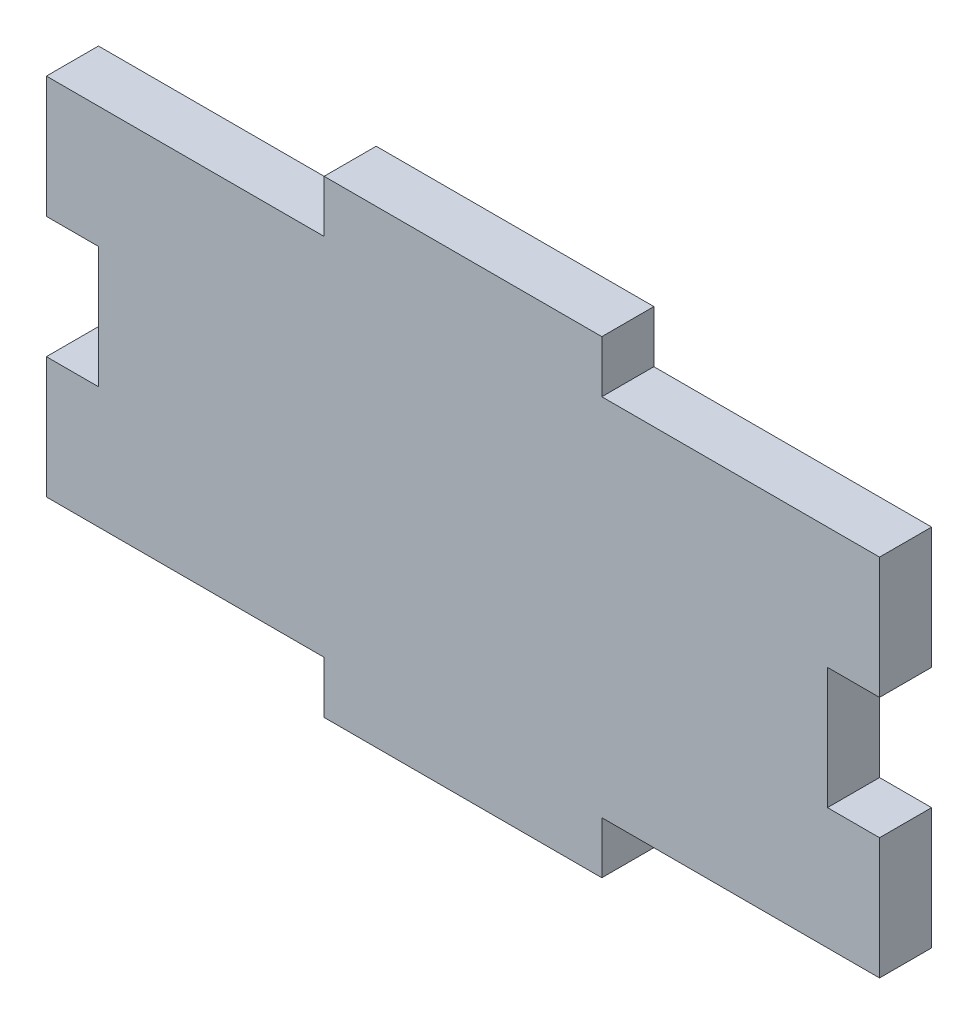
ISO-10303-21;
HEADER;
FILE_DESCRIPTION(('STEP AP214'),'2;1');
FILE_NAME('part.step','',(''),(''),'','','');
FILE_SCHEMA(('AUTOMOTIVE_DESIGN { 1 0 10303 214 1 1 1 1 }'));
ENDSEC;
DATA;
#1=APPLICATION_CONTEXT('core data for automotive mechanical design processes');
#2=APPLICATION_PROTOCOL_DEFINITION('international standard','automotive_design',2000,#1);
#3=PRODUCT_CONTEXT('',#1,'mechanical');
#4=PRODUCT('Part','Part','',(#3));
#5=PRODUCT_RELATED_PRODUCT_CATEGORY('part','',(#4));
#6=PRODUCT_DEFINITION_FORMATION('','',#4);
#7=PRODUCT_DEFINITION_CONTEXT('part definition',#1,'design');
#8=PRODUCT_DEFINITION('design','',#6,#7);
#9=PRODUCT_DEFINITION_SHAPE('','',#8);
#10=(LENGTH_UNIT() NAMED_UNIT(*) SI_UNIT(.MILLI.,.METRE.));
#11=(NAMED_UNIT(*) PLANE_ANGLE_UNIT() SI_UNIT($,.RADIAN.));
#12=(NAMED_UNIT(*) SI_UNIT($,.STERADIAN.) SOLID_ANGLE_UNIT());
#13=UNCERTAINTY_MEASURE_WITH_UNIT(LENGTH_MEASURE(1.E-05),#10,'distance_accuracy_value','');
#14=(GEOMETRIC_REPRESENTATION_CONTEXT(3) GLOBAL_UNCERTAINTY_ASSIGNED_CONTEXT((#13)) GLOBAL_UNIT_ASSIGNED_CONTEXT((#10,
#11,#12)) REPRESENTATION_CONTEXT('',''));
#15=CARTESIAN_POINT('',(0.,0.,0.));
#16=DIRECTION('',(0.,0.,1.));
#17=DIRECTION('',(1.,0.,0.));
#18=AXIS2_PLACEMENT_3D('',#15,#16,#17);
#19=CARTESIAN_POINT('',(-24.,10.5,3.));
#20=DIRECTION('',(1.,0.,0.));
#21=DIRECTION('',(0.,0.,-1.));
#22=AXIS2_PLACEMENT_3D('',#19,#20,#21);
#23=PLANE('',#22);
#24=DIRECTION('',(0.,-1.,0.));
#25=VECTOR('',#24,1.);
#26=CARTESIAN_POINT('',(-24.,10.5,0.));
#27=LINE('',#26,#25);
#28=CARTESIAN_POINT('',(-24.,10.5,0.));
#29=VERTEX_POINT('',#28);
#30=CARTESIAN_POINT('',(-24.,3.5,0.));
#31=VERTEX_POINT('',#30);
#32=EDGE_CURVE('E201',#29,#31,#27,.T.);
#33=ORIENTED_EDGE('',*,*,#32,.T.);
#34=DIRECTION('',(0.,0.,-1.));
#35=VECTOR('',#34,1.);
#36=CARTESIAN_POINT('',(-24.,3.5,3.));
#37=LINE('',#36,#35);
#38=CARTESIAN_POINT('',(-24.,3.5,3.));
#39=VERTEX_POINT('',#38);
#40=EDGE_CURVE('E11',#39,#31,#37,.T.);
#41=ORIENTED_EDGE('',*,*,#40,.F.);
#42=DIRECTION('',(0.,-1.,0.));
#43=VECTOR('',#42,1.);
#44=CARTESIAN_POINT('',(-24.,10.5,3.));
#45=LINE('',#44,#43);
#46=CARTESIAN_POINT('',(-24.,10.5,3.));
#47=VERTEX_POINT('',#46);
#48=EDGE_CURVE('E249',#47,#39,#45,.T.);
#49=ORIENTED_EDGE('',*,*,#48,.F.);
#50=DIRECTION('',(0.,0.,-1.));
#51=VECTOR('',#50,1.);
#52=CARTESIAN_POINT('',(-24.,10.5,3.));
#53=LINE('',#52,#51);
#54=EDGE_CURVE('E48',#47,#29,#53,.T.);
#55=ORIENTED_EDGE('',*,*,#54,.T.);
#56=EDGE_LOOP('',(#33,#41,#49,#55));
#57=FACE_BOUND('',#56,.T.);
#58=ADVANCED_FACE('F32',(#57),#23,.F.);
#59=CARTESIAN_POINT('',(-24.,3.5,3.));
#60=DIRECTION('',(0.,1.,0.));
#61=DIRECTION('',(-1.,0.,0.));
#62=AXIS2_PLACEMENT_3D('',#59,#60,#61);
#63=PLANE('',#62);
#64=DIRECTION('',(1.,0.,0.));
#65=VECTOR('',#64,1.);
#66=CARTESIAN_POINT('',(-24.,3.5,0.));
#67=LINE('',#66,#65);
#68=CARTESIAN_POINT('',(-21.,3.5,0.));
#69=VERTEX_POINT('',#68);
#70=EDGE_CURVE('E203',#31,#69,#67,.T.);
#71=ORIENTED_EDGE('',*,*,#70,.T.);
#72=DIRECTION('',(0.,0.,-1.));
#73=VECTOR('',#72,1.);
#74=CARTESIAN_POINT('',(-21.,3.5,3.));
#75=LINE('',#74,#73);
#76=CARTESIAN_POINT('',(-21.,3.5,3.));
#77=VERTEX_POINT('',#76);
#78=EDGE_CURVE('E40',#77,#69,#75,.T.);
#79=ORIENTED_EDGE('',*,*,#78,.F.);
#80=DIRECTION('',(1.,0.,0.));
#81=VECTOR('',#80,1.);
#82=CARTESIAN_POINT('',(-24.,3.5,3.));
#83=LINE('',#82,#81);
#84=EDGE_CURVE('E122',#39,#77,#83,.T.);
#85=ORIENTED_EDGE('',*,*,#84,.F.);
#86=ORIENTED_EDGE('',*,*,#40,.T.);
#87=EDGE_LOOP('',(#71,#79,#85,#86));
#88=FACE_BOUND('',#87,.T.);
#89=ADVANCED_FACE('F356',(#88),#63,.F.);
#90=CARTESIAN_POINT('',(-21.,3.5,3.));
#91=DIRECTION('',(1.,0.,0.));
#92=DIRECTION('',(0.,0.,-1.));
#93=AXIS2_PLACEMENT_3D('',#90,#91,#92);
#94=PLANE('',#93);
#95=DIRECTION('',(0.,-1.,0.));
#96=VECTOR('',#95,1.);
#97=CARTESIAN_POINT('',(-21.,3.5,0.));
#98=LINE('',#97,#96);
#99=CARTESIAN_POINT('',(-21.,-3.5,0.));
#100=VERTEX_POINT('',#99);
#101=EDGE_CURVE('E205',#69,#100,#98,.T.);
#102=ORIENTED_EDGE('',*,*,#101,.T.);
#103=DIRECTION('',(0.,0.,-1.));
#104=VECTOR('',#103,1.);
#105=CARTESIAN_POINT('',(-21.,-3.5,3.));
#106=LINE('',#105,#104);
#107=CARTESIAN_POINT('',(-21.,-3.5,3.));
#108=VERTEX_POINT('',#107);
#109=EDGE_CURVE('E285',#108,#100,#106,.T.);
#110=ORIENTED_EDGE('',*,*,#109,.F.);
#111=DIRECTION('',(0.,-1.,0.));
#112=VECTOR('',#111,1.);
#113=CARTESIAN_POINT('',(-21.,3.5,3.));
#114=LINE('',#113,#112);
#115=EDGE_CURVE('E293',#77,#108,#114,.T.);
#116=ORIENTED_EDGE('',*,*,#115,.F.);
#117=ORIENTED_EDGE('',*,*,#78,.T.);
#118=EDGE_LOOP('',(#102,#110,#116,#117));
#119=FACE_BOUND('',#118,.T.);
#120=ADVANCED_FACE('F291',(#119),#94,.F.);
#121=CARTESIAN_POINT('',(-21.,-3.5,3.));
#122=DIRECTION('',(0.,-1.,0.));
#123=DIRECTION('',(1.,0.,0.));
#124=AXIS2_PLACEMENT_3D('',#121,#122,#123);
#125=PLANE('',#124);
#126=DIRECTION('',(-1.,0.,0.));
#127=VECTOR('',#126,1.);
#128=CARTESIAN_POINT('',(-21.,-3.5,0.));
#129=LINE('',#128,#127);
#130=CARTESIAN_POINT('',(-24.,-3.5,0.));
#131=VERTEX_POINT('',#130);
#132=EDGE_CURVE('E207',#100,#131,#129,.T.);
#133=ORIENTED_EDGE('',*,*,#132,.T.);
#134=DIRECTION('',(0.,0.,-1.));
#135=VECTOR('',#134,1.);
#136=CARTESIAN_POINT('',(-24.,-3.5,3.));
#137=LINE('',#136,#135);
#138=CARTESIAN_POINT('',(-24.,-3.5,3.));
#139=VERTEX_POINT('',#138);
#140=EDGE_CURVE('E282',#139,#131,#137,.T.);
#141=ORIENTED_EDGE('',*,*,#140,.F.);
#142=DIRECTION('',(-1.,0.,0.));
#143=VECTOR('',#142,1.);
#144=CARTESIAN_POINT('',(-21.,-3.5,3.));
#145=LINE('',#144,#143);
#146=EDGE_CURVE('E310',#108,#139,#145,.T.);
#147=ORIENTED_EDGE('',*,*,#146,.F.);
#148=ORIENTED_EDGE('',*,*,#109,.T.);
#149=EDGE_LOOP('',(#133,#141,#147,#148));
#150=FACE_BOUND('',#149,.T.);
#151=ADVANCED_FACE('F301',(#150),#125,.F.);
#152=CARTESIAN_POINT('',(-24.,-3.5,3.));
#153=DIRECTION('',(1.,0.,0.));
#154=DIRECTION('',(0.,0.,-1.));
#155=AXIS2_PLACEMENT_3D('',#152,#153,#154);
#156=PLANE('',#155);
#157=DIRECTION('',(0.,-1.,0.));
#158=VECTOR('',#157,1.);
#159=CARTESIAN_POINT('',(-24.,-3.5,0.));
#160=LINE('',#159,#158);
#161=CARTESIAN_POINT('',(-24.,-10.5,0.));
#162=VERTEX_POINT('',#161);
#163=EDGE_CURVE('E209',#131,#162,#160,.T.);
#164=ORIENTED_EDGE('',*,*,#163,.T.);
#165=DIRECTION('',(0.,0.,-1.));
#166=VECTOR('',#165,1.);
#167=CARTESIAN_POINT('',(-24.,-10.5,3.));
#168=LINE('',#167,#166);
#169=CARTESIAN_POINT('',(-24.,-10.5,3.));
#170=VERTEX_POINT('',#169);
#171=EDGE_CURVE('E279',#170,#162,#168,.T.);
#172=ORIENTED_EDGE('',*,*,#171,.F.);
#173=DIRECTION('',(0.,-1.,0.));
#174=VECTOR('',#173,1.);
#175=CARTESIAN_POINT('',(-24.,-3.5,3.));
#176=LINE('',#175,#174);
#177=EDGE_CURVE('E307',#139,#170,#176,.T.);
#178=ORIENTED_EDGE('',*,*,#177,.F.);
#179=ORIENTED_EDGE('',*,*,#140,.T.);
#180=EDGE_LOOP('',(#164,#172,#178,#179));
#181=FACE_BOUND('',#180,.T.);
#182=ADVANCED_FACE('F305',(#181),#156,.F.);
#183=CARTESIAN_POINT('',(-24.,-10.5,3.));
#184=DIRECTION('',(0.,1.,0.));
#185=DIRECTION('',(0.,0.,1.));
#186=AXIS2_PLACEMENT_3D('',#183,#184,#185);
#187=PLANE('',#186);
#188=DIRECTION('',(1.,0.,0.));
#189=VECTOR('',#188,1.);
#190=CARTESIAN_POINT('',(-24.,-10.5,0.));
#191=LINE('',#190,#189);
#192=CARTESIAN_POINT('',(-8.,-10.5,0.));
#193=VERTEX_POINT('',#192);
#194=EDGE_CURVE('E211',#162,#193,#191,.T.);
#195=ORIENTED_EDGE('',*,*,#194,.T.);
#196=DIRECTION('',(0.,0.,-1.));
#197=VECTOR('',#196,1.);
#198=CARTESIAN_POINT('',(-8.,-10.5,3.));
#199=LINE('',#198,#197);
#200=CARTESIAN_POINT('',(-8.,-10.5,3.));
#201=VERTEX_POINT('',#200);
#202=EDGE_CURVE('E276',#201,#193,#199,.T.);
#203=ORIENTED_EDGE('',*,*,#202,.F.);
#204=DIRECTION('',(1.,0.,0.));
#205=VECTOR('',#204,1.);
#206=CARTESIAN_POINT('',(-24.,-10.5,3.));
#207=LINE('',#206,#205);
#208=EDGE_CURVE('E309',#170,#201,#207,.T.);
#209=ORIENTED_EDGE('',*,*,#208,.F.);
#210=ORIENTED_EDGE('',*,*,#171,.T.);
#211=EDGE_LOOP('',(#195,#203,#209,#210));
#212=FACE_BOUND('',#211,.T.);
#213=ADVANCED_FACE('F372',(#212),#187,.F.);
#214=CARTESIAN_POINT('',(-8.,-10.5,3.));
#215=DIRECTION('',(1.,0.,0.));
#216=DIRECTION('',(0.,0.,-1.));
#217=AXIS2_PLACEMENT_3D('',#214,#215,#216);
#218=PLANE('',#217);
#219=DIRECTION('',(0.,-1.,0.));
#220=VECTOR('',#219,1.);
#221=CARTESIAN_POINT('',(-8.,-10.5,0.));
#222=LINE('',#221,#220);
#223=CARTESIAN_POINT('',(-8.,-13.5,0.));
#224=VERTEX_POINT('',#223);
#225=EDGE_CURVE('E213',#193,#224,#222,.T.);
#226=ORIENTED_EDGE('',*,*,#225,.T.);
#227=DIRECTION('',(0.,0.,-1.));
#228=VECTOR('',#227,1.);
#229=CARTESIAN_POINT('',(-8.,-13.5,3.));
#230=LINE('',#229,#228);
#231=CARTESIAN_POINT('',(-8.,-13.5,3.));
#232=VERTEX_POINT('',#231);
#233=EDGE_CURVE('E273',#232,#224,#230,.T.);
#234=ORIENTED_EDGE('',*,*,#233,.F.);
#235=DIRECTION('',(0.,-1.,0.));
#236=VECTOR('',#235,1.);
#237=CARTESIAN_POINT('',(-8.,-10.5,3.));
#238=LINE('',#237,#236);
#239=EDGE_CURVE('E312',#201,#232,#238,.T.);
#240=ORIENTED_EDGE('',*,*,#239,.F.);
#241=ORIENTED_EDGE('',*,*,#202,.T.);
#242=EDGE_LOOP('',(#226,#234,#240,#241));
#243=FACE_BOUND('',#242,.T.);
#244=ADVANCED_FACE('F375',(#243),#218,.F.);
#245=CARTESIAN_POINT('',(-8.,-13.5,3.));
#246=DIRECTION('',(0.,1.,0.));
#247=DIRECTION('',(0.,0.,1.));
#248=AXIS2_PLACEMENT_3D('',#245,#246,#247);
#249=PLANE('',#248);
#250=DIRECTION('',(1.,0.,0.));
#251=VECTOR('',#250,1.);
#252=CARTESIAN_POINT('',(-8.,-13.5,0.));
#253=LINE('',#252,#251);
#254=CARTESIAN_POINT('',(8.,-13.5,0.));
#255=VERTEX_POINT('',#254);
#256=EDGE_CURVE('E215',#224,#255,#253,.T.);
#257=ORIENTED_EDGE('',*,*,#256,.T.);
#258=DIRECTION('',(0.,0.,-1.));
#259=VECTOR('',#258,1.);
#260=CARTESIAN_POINT('',(8.,-13.5,3.));
#261=LINE('',#260,#259);
#262=CARTESIAN_POINT('',(8.,-13.5,3.));
#263=VERTEX_POINT('',#262);
#264=EDGE_CURVE('E270',#263,#255,#261,.T.);
#265=ORIENTED_EDGE('',*,*,#264,.F.);
#266=DIRECTION('',(1.,0.,0.));
#267=VECTOR('',#266,1.);
#268=CARTESIAN_POINT('',(-8.,-13.5,3.));
#269=LINE('',#268,#267);
#270=EDGE_CURVE('E318',#232,#263,#269,.T.);
#271=ORIENTED_EDGE('',*,*,#270,.F.);
#272=ORIENTED_EDGE('',*,*,#233,.T.);
#273=EDGE_LOOP('',(#257,#265,#271,#272));
#274=FACE_BOUND('',#273,.T.);
#275=ADVANCED_FACE('F379',(#274),#249,.F.);
#276=CARTESIAN_POINT('',(8.,-13.5,3.));
#277=DIRECTION('',(-1.,0.,0.));
#278=DIRECTION('',(0.,0.,1.));
#279=AXIS2_PLACEMENT_3D('',#276,#277,#278);
#280=PLANE('',#279);
#281=DIRECTION('',(0.,1.,0.));
#282=VECTOR('',#281,1.);
#283=CARTESIAN_POINT('',(8.,-13.5,0.));
#284=LINE('',#283,#282);
#285=CARTESIAN_POINT('',(8.,-10.5,0.));
#286=VERTEX_POINT('',#285);
#287=EDGE_CURVE('E217',#255,#286,#284,.T.);
#288=ORIENTED_EDGE('',*,*,#287,.T.);
#289=DIRECTION('',(0.,0.,-1.));
#290=VECTOR('',#289,1.);
#291=CARTESIAN_POINT('',(8.,-10.5,3.));
#292=LINE('',#291,#290);
#293=CARTESIAN_POINT('',(8.,-10.5,3.));
#294=VERTEX_POINT('',#293);
#295=EDGE_CURVE('E267',#294,#286,#292,.T.);
#296=ORIENTED_EDGE('',*,*,#295,.F.);
#297=DIRECTION('',(0.,1.,0.));
#298=VECTOR('',#297,1.);
#299=CARTESIAN_POINT('',(8.,-13.5,3.));
#300=LINE('',#299,#298);
#301=EDGE_CURVE('E320',#263,#294,#300,.T.);
#302=ORIENTED_EDGE('',*,*,#301,.F.);
#303=ORIENTED_EDGE('',*,*,#264,.T.);
#304=EDGE_LOOP('',(#288,#296,#302,#303));
#305=FACE_BOUND('',#304,.T.);
#306=ADVANCED_FACE('F383',(#305),#280,.F.);
#307=CARTESIAN_POINT('',(8.,-10.5,3.));
#308=DIRECTION('',(0.,1.,0.));
#309=DIRECTION('',(0.,0.,1.));
#310=AXIS2_PLACEMENT_3D('',#307,#308,#309);
#311=PLANE('',#310);
#312=DIRECTION('',(1.,0.,0.));
#313=VECTOR('',#312,1.);
#314=CARTESIAN_POINT('',(8.,-10.5,0.));
#315=LINE('',#314,#313);
#316=CARTESIAN_POINT('',(24.,-10.5,0.));
#317=VERTEX_POINT('',#316);
#318=EDGE_CURVE('E219',#286,#317,#315,.T.);
#319=ORIENTED_EDGE('',*,*,#318,.T.);
#320=DIRECTION('',(0.,0.,-1.));
#321=VECTOR('',#320,1.);
#322=CARTESIAN_POINT('',(24.,-10.5,3.));
#323=LINE('',#322,#321);
#324=CARTESIAN_POINT('',(24.,-10.5,3.));
#325=VERTEX_POINT('',#324);
#326=EDGE_CURVE('E265',#325,#317,#323,.T.);
#327=ORIENTED_EDGE('',*,*,#326,.F.);
#328=DIRECTION('',(1.,0.,0.));
#329=VECTOR('',#328,1.);
#330=CARTESIAN_POINT('',(8.,-10.5,3.));
#331=LINE('',#330,#329);
#332=EDGE_CURVE('E322',#294,#325,#331,.T.);
#333=ORIENTED_EDGE('',*,*,#332,.F.);
#334=ORIENTED_EDGE('',*,*,#295,.T.);
#335=EDGE_LOOP('',(#319,#327,#333,#334));
#336=FACE_BOUND('',#335,.T.);
#337=ADVANCED_FACE('F387',(#336),#311,.F.);
#338=CARTESIAN_POINT('',(24.,-3.5,3.));
#339=DIRECTION('',(1.,0.,0.));
#340=DIRECTION('',(0.,0.,-1.));
#341=AXIS2_PLACEMENT_3D('',#338,#339,#340);
#342=PLANE('',#341);
#343=DIRECTION('',(0.,-1.,0.));
#344=VECTOR('',#343,1.);
#345=CARTESIAN_POINT('',(24.,-3.5,0.));
#346=LINE('',#345,#344);
#347=CARTESIAN_POINT('',(24.,-3.5,0.));
#348=VERTEX_POINT('',#347);
#349=EDGE_CURVE('E222',#348,#317,#346,.T.);
#350=ORIENTED_EDGE('',*,*,#349,.F.);
#351=DIRECTION('',(0.,0.,-1.));
#352=VECTOR('',#351,1.);
#353=CARTESIAN_POINT('',(24.,-3.5,3.));
#354=LINE('',#353,#352);
#355=CARTESIAN_POINT('',(24.,-3.5,3.));
#356=VERTEX_POINT('',#355);
#357=EDGE_CURVE('E263',#356,#348,#354,.T.);
#358=ORIENTED_EDGE('',*,*,#357,.F.);
#359=DIRECTION('',(0.,-1.,0.));
#360=VECTOR('',#359,1.);
#361=CARTESIAN_POINT('',(24.,-3.5,3.));
#362=LINE('',#361,#360);
#363=EDGE_CURVE('E324',#356,#325,#362,.T.);
#364=ORIENTED_EDGE('',*,*,#363,.T.);
#365=ORIENTED_EDGE('',*,*,#326,.T.);
#366=EDGE_LOOP('',(#350,#358,#364,#365));
#367=FACE_BOUND('',#366,.T.);
#368=ADVANCED_FACE('F391',(#367),#342,.T.);
#369=CARTESIAN_POINT('',(21.,-3.5,3.));
#370=DIRECTION('',(0.,1.,0.));
#371=DIRECTION('',(0.,0.,1.));
#372=AXIS2_PLACEMENT_3D('',#369,#370,#371);
#373=PLANE('',#372);
#374=DIRECTION('',(1.,0.,0.));
#375=VECTOR('',#374,1.);
#376=CARTESIAN_POINT('',(21.,-3.5,0.));
#377=LINE('',#376,#375);
#378=CARTESIAN_POINT('',(21.,-3.5,0.));
#379=VERTEX_POINT('',#378);
#380=EDGE_CURVE('E225',#379,#348,#377,.T.);
#381=ORIENTED_EDGE('',*,*,#380,.F.);
#382=DIRECTION('',(0.,0.,-1.));
#383=VECTOR('',#382,1.);
#384=CARTESIAN_POINT('',(21.,-3.5,3.));
#385=LINE('',#384,#383);
#386=CARTESIAN_POINT('',(21.,-3.5,3.));
#387=VERTEX_POINT('',#386);
#388=EDGE_CURVE('E261',#387,#379,#385,.T.);
#389=ORIENTED_EDGE('',*,*,#388,.F.);
#390=DIRECTION('',(1.,0.,0.));
#391=VECTOR('',#390,1.);
#392=CARTESIAN_POINT('',(21.,-3.5,3.));
#393=LINE('',#392,#391);
#394=EDGE_CURVE('E327',#387,#356,#393,.T.);
#395=ORIENTED_EDGE('',*,*,#394,.T.);
#396=ORIENTED_EDGE('',*,*,#357,.T.);
#397=EDGE_LOOP('',(#381,#389,#395,#396));
#398=FACE_BOUND('',#397,.T.);
#399=ADVANCED_FACE('F395',(#398),#373,.T.);
#400=CARTESIAN_POINT('',(21.,3.5,3.));
#401=DIRECTION('',(1.,0.,0.));
#402=DIRECTION('',(0.,1.,0.));
#403=AXIS2_PLACEMENT_3D('',#400,#401,#402);
#404=PLANE('',#403);
#405=DIRECTION('',(0.,-1.,0.));
#406=VECTOR('',#405,1.);
#407=CARTESIAN_POINT('',(21.,3.5,0.));
#408=LINE('',#407,#406);
#409=CARTESIAN_POINT('',(21.,3.5,0.));
#410=VERTEX_POINT('',#409);
#411=EDGE_CURVE('E228',#410,#379,#408,.T.);
#412=ORIENTED_EDGE('',*,*,#411,.F.);
#413=DIRECTION('',(0.,0.,-1.));
#414=VECTOR('',#413,1.);
#415=CARTESIAN_POINT('',(21.,3.5,3.));
#416=LINE('',#415,#414);
#417=CARTESIAN_POINT('',(21.,3.5,3.));
#418=VERTEX_POINT('',#417);
#419=EDGE_CURVE('E259',#418,#410,#416,.T.);
#420=ORIENTED_EDGE('',*,*,#419,.F.);
#421=DIRECTION('',(0.,-1.,0.));
#422=VECTOR('',#421,1.);
#423=CARTESIAN_POINT('',(21.,3.5,3.));
#424=LINE('',#423,#422);
#425=EDGE_CURVE('E330',#418,#387,#424,.T.);
#426=ORIENTED_EDGE('',*,*,#425,.T.);
#427=ORIENTED_EDGE('',*,*,#388,.T.);
#428=EDGE_LOOP('',(#412,#420,#426,#427));
#429=FACE_BOUND('',#428,.T.);
#430=ADVANCED_FACE('F399',(#429),#404,.T.);
#431=CARTESIAN_POINT('',(24.,3.5,3.));
#432=DIRECTION('',(0.,-1.,0.));
#433=DIRECTION('',(1.,0.,0.));
#434=AXIS2_PLACEMENT_3D('',#431,#432,#433);
#435=PLANE('',#434);
#436=DIRECTION('',(-1.,0.,0.));
#437=VECTOR('',#436,1.);
#438=CARTESIAN_POINT('',(24.,3.5,0.));
#439=LINE('',#438,#437);
#440=CARTESIAN_POINT('',(24.,3.5,0.));
#441=VERTEX_POINT('',#440);
#442=EDGE_CURVE('E231',#441,#410,#439,.T.);
#443=ORIENTED_EDGE('',*,*,#442,.F.);
#444=DIRECTION('',(0.,0.,-1.));
#445=VECTOR('',#444,1.);
#446=CARTESIAN_POINT('',(24.,3.5,3.));
#447=LINE('',#446,#445);
#448=CARTESIAN_POINT('',(24.,3.5,3.));
#449=VERTEX_POINT('',#448);
#450=EDGE_CURVE('E257',#449,#441,#447,.T.);
#451=ORIENTED_EDGE('',*,*,#450,.F.);
#452=DIRECTION('',(-1.,0.,0.));
#453=VECTOR('',#452,1.);
#454=CARTESIAN_POINT('',(24.,3.5,3.));
#455=LINE('',#454,#453);
#456=EDGE_CURVE('E333',#449,#418,#455,.T.);
#457=ORIENTED_EDGE('',*,*,#456,.T.);
#458=ORIENTED_EDGE('',*,*,#419,.T.);
#459=EDGE_LOOP('',(#443,#451,#457,#458));
#460=FACE_BOUND('',#459,.T.);
#461=ADVANCED_FACE('F403',(#460),#435,.T.);
#462=CARTESIAN_POINT('',(24.,10.5,3.));
#463=DIRECTION('',(1.,0.,0.));
#464=DIRECTION('',(0.,0.,-1.));
#465=AXIS2_PLACEMENT_3D('',#462,#463,#464);
#466=PLANE('',#465);
#467=DIRECTION('',(0.,-1.,0.));
#468=VECTOR('',#467,1.);
#469=CARTESIAN_POINT('',(24.,10.5,0.));
#470=LINE('',#469,#468);
#471=CARTESIAN_POINT('',(24.,10.5,0.));
#472=VERTEX_POINT('',#471);
#473=EDGE_CURVE('E234',#472,#441,#470,.T.);
#474=ORIENTED_EDGE('',*,*,#473,.F.);
#475=DIRECTION('',(0.,0.,-1.));
#476=VECTOR('',#475,1.);
#477=CARTESIAN_POINT('',(24.,10.5,3.));
#478=LINE('',#477,#476);
#479=CARTESIAN_POINT('',(24.,10.5,3.));
#480=VERTEX_POINT('',#479);
#481=EDGE_CURVE('E255',#480,#472,#478,.T.);
#482=ORIENTED_EDGE('',*,*,#481,.F.);
#483=DIRECTION('',(0.,-1.,0.));
#484=VECTOR('',#483,1.);
#485=CARTESIAN_POINT('',(24.,10.5,3.));
#486=LINE('',#485,#484);
#487=EDGE_CURVE('E336',#480,#449,#486,.T.);
#488=ORIENTED_EDGE('',*,*,#487,.T.);
#489=ORIENTED_EDGE('',*,*,#450,.T.);
#490=EDGE_LOOP('',(#474,#482,#488,#489));
#491=FACE_BOUND('',#490,.T.);
#492=ADVANCED_FACE('F407',(#491),#466,.T.);
#493=CARTESIAN_POINT('',(8.,10.5,3.));
#494=DIRECTION('',(0.,1.,0.));
#495=DIRECTION('',(-1.,0.,0.));
#496=AXIS2_PLACEMENT_3D('',#493,#494,#495);
#497=PLANE('',#496);
#498=DIRECTION('',(1.,0.,0.));
#499=VECTOR('',#498,1.);
#500=CARTESIAN_POINT('',(8.,10.5,0.));
#501=LINE('',#500,#499);
#502=CARTESIAN_POINT('',(8.,10.5,0.));
#503=VERTEX_POINT('',#502);
#504=EDGE_CURVE('E237',#503,#472,#501,.T.);
#505=ORIENTED_EDGE('',*,*,#504,.F.);
#506=DIRECTION('',(0.,0.,-1.));
#507=VECTOR('',#506,1.);
#508=CARTESIAN_POINT('',(8.,10.5,3.));
#509=LINE('',#508,#507);
#510=CARTESIAN_POINT('',(8.,10.5,3.));
#511=VERTEX_POINT('',#510);
#512=EDGE_CURVE('E253',#511,#503,#509,.T.);
#513=ORIENTED_EDGE('',*,*,#512,.F.);
#514=DIRECTION('',(1.,0.,0.));
#515=VECTOR('',#514,1.);
#516=CARTESIAN_POINT('',(8.,10.5,3.));
#517=LINE('',#516,#515);
#518=EDGE_CURVE('E339',#511,#480,#517,.T.);
#519=ORIENTED_EDGE('',*,*,#518,.T.);
#520=ORIENTED_EDGE('',*,*,#481,.T.);
#521=EDGE_LOOP('',(#505,#513,#519,#520));
#522=FACE_BOUND('',#521,.T.);
#523=ADVANCED_FACE('F411',(#522),#497,.T.);
#524=CARTESIAN_POINT('',(8.,13.5,3.));
#525=DIRECTION('',(1.,0.,0.));
#526=DIRECTION('',(0.,0.,-1.));
#527=AXIS2_PLACEMENT_3D('',#524,#525,#526);
#528=PLANE('',#527);
#529=DIRECTION('',(0.,-1.,0.));
#530=VECTOR('',#529,1.);
#531=CARTESIAN_POINT('',(8.,13.5,0.));
#532=LINE('',#531,#530);
#533=CARTESIAN_POINT('',(8.,13.5,0.));
#534=VERTEX_POINT('',#533);
#535=EDGE_CURVE('E240',#534,#503,#532,.T.);
#536=ORIENTED_EDGE('',*,*,#535,.F.);
#537=DIRECTION('',(0.,0.,-1.));
#538=VECTOR('',#537,1.);
#539=CARTESIAN_POINT('',(8.,13.5,3.));
#540=LINE('',#539,#538);
#541=CARTESIAN_POINT('',(8.,13.5,3.));
#542=VERTEX_POINT('',#541);
#543=EDGE_CURVE('E183',#542,#534,#540,.T.);
#544=ORIENTED_EDGE('',*,*,#543,.F.);
#545=DIRECTION('',(0.,-1.,0.));
#546=VECTOR('',#545,1.);
#547=CARTESIAN_POINT('',(8.,13.5,3.));
#548=LINE('',#547,#546);
#549=EDGE_CURVE('E193',#542,#511,#548,.T.);
#550=ORIENTED_EDGE('',*,*,#549,.T.);
#551=ORIENTED_EDGE('',*,*,#512,.T.);
#552=EDGE_LOOP('',(#536,#544,#550,#551));
#553=FACE_BOUND('',#552,.T.);
#554=ADVANCED_FACE('F343',(#553),#528,.T.);
#555=CARTESIAN_POINT('',(-8.,13.5,3.));
#556=DIRECTION('',(0.,1.,0.));
#557=DIRECTION('',(-1.,0.,0.));
#558=AXIS2_PLACEMENT_3D('',#555,#556,#557);
#559=PLANE('',#558);
#560=DIRECTION('',(1.,0.,0.));
#561=VECTOR('',#560,1.);
#562=CARTESIAN_POINT('',(-8.,13.5,0.));
#563=LINE('',#562,#561);
#564=CARTESIAN_POINT('',(-8.,13.5,0.));
#565=VERTEX_POINT('',#564);
#566=EDGE_CURVE('E179',#565,#534,#563,.T.);
#567=ORIENTED_EDGE('',*,*,#566,.F.);
#568=DIRECTION('',(0.,0.,-1.));
#569=VECTOR('',#568,1.);
#570=CARTESIAN_POINT('',(-8.,13.5,3.));
#571=LINE('',#570,#569);
#572=CARTESIAN_POINT('',(-8.,13.5,3.));
#573=VERTEX_POINT('',#572);
#574=EDGE_CURVE('E174',#573,#565,#571,.T.);
#575=ORIENTED_EDGE('',*,*,#574,.F.);
#576=DIRECTION('',(1.,0.,0.));
#577=VECTOR('',#576,1.);
#578=CARTESIAN_POINT('',(-8.,13.5,3.));
#579=LINE('',#578,#577);
#580=EDGE_CURVE('E177',#573,#542,#579,.T.);
#581=ORIENTED_EDGE('',*,*,#580,.T.);
#582=ORIENTED_EDGE('',*,*,#543,.T.);
#583=EDGE_LOOP('',(#567,#575,#581,#582));
#584=FACE_BOUND('',#583,.T.);
#585=ADVANCED_FACE('F176',(#584),#559,.T.);
#586=CARTESIAN_POINT('',(-8.,10.5,3.));
#587=DIRECTION('',(-1.,0.,0.));
#588=DIRECTION('',(0.,0.,1.));
#589=AXIS2_PLACEMENT_3D('',#586,#587,#588);
#590=PLANE('',#589);
#591=DIRECTION('',(0.,1.,0.));
#592=VECTOR('',#591,1.);
#593=CARTESIAN_POINT('',(-8.,10.5,0.));
#594=LINE('',#593,#592);
#595=CARTESIAN_POINT('',(-8.,10.5,0.));
#596=VERTEX_POINT('',#595);
#597=EDGE_CURVE('E244',#596,#565,#594,.T.);
#598=ORIENTED_EDGE('',*,*,#597,.F.);
#599=DIRECTION('',(0.,0.,-1.));
#600=VECTOR('',#599,1.);
#601=CARTESIAN_POINT('',(-8.,10.5,3.));
#602=LINE('',#601,#600);
#603=CARTESIAN_POINT('',(-8.,10.5,3.));
#604=VERTEX_POINT('',#603);
#605=EDGE_CURVE('E110',#604,#596,#602,.T.);
#606=ORIENTED_EDGE('',*,*,#605,.F.);
#607=DIRECTION('',(0.,1.,0.));
#608=VECTOR('',#607,1.);
#609=CARTESIAN_POINT('',(-8.,10.5,3.));
#610=LINE('',#609,#608);
#611=EDGE_CURVE('E190',#604,#573,#610,.T.);
#612=ORIENTED_EDGE('',*,*,#611,.T.);
#613=ORIENTED_EDGE('',*,*,#574,.T.);
#614=EDGE_LOOP('',(#598,#606,#612,#613));
#615=FACE_BOUND('',#614,.T.);
#616=ADVANCED_FACE('F195',(#615),#590,.T.);
#617=CARTESIAN_POINT('',(-24.,10.5,3.));
#618=DIRECTION('',(0.,1.,0.));
#619=DIRECTION('',(-1.,0.,0.));
#620=AXIS2_PLACEMENT_3D('',#617,#618,#619);
#621=PLANE('',#620);
#622=DIRECTION('',(1.,0.,0.));
#623=VECTOR('',#622,1.);
#624=CARTESIAN_POINT('',(-24.,10.5,0.));
#625=LINE('',#624,#623);
#626=EDGE_CURVE('E246',#29,#596,#625,.T.);
#627=ORIENTED_EDGE('',*,*,#626,.F.);
#628=ORIENTED_EDGE('',*,*,#54,.F.);
#629=DIRECTION('',(1.,0.,0.));
#630=VECTOR('',#629,1.);
#631=CARTESIAN_POINT('',(-24.,10.5,3.));
#632=LINE('',#631,#630);
#633=EDGE_CURVE('E196',#47,#604,#632,.T.);
#634=ORIENTED_EDGE('',*,*,#633,.T.);
#635=ORIENTED_EDGE('',*,*,#605,.T.);
#636=EDGE_LOOP('',(#627,#628,#634,#635));
#637=FACE_BOUND('',#636,.T.);
#638=ADVANCED_FACE('F345',(#637),#621,.T.);
#639=CARTESIAN_POINT('',(0.,0.,3.));
#640=DIRECTION('',(0.,0.,1.));
#641=DIRECTION('',(1.,0.,0.));
#642=AXIS2_PLACEMENT_3D('',#639,#640,#641);
#643=PLANE('',#642);
#644=ORIENTED_EDGE('',*,*,#48,.T.);
#645=ORIENTED_EDGE('',*,*,#84,.T.);
#646=ORIENTED_EDGE('',*,*,#115,.T.);
#647=ORIENTED_EDGE('',*,*,#146,.T.);
#648=ORIENTED_EDGE('',*,*,#177,.T.);
#649=ORIENTED_EDGE('',*,*,#208,.T.);
#650=ORIENTED_EDGE('',*,*,#239,.T.);
#651=ORIENTED_EDGE('',*,*,#270,.T.);
#652=ORIENTED_EDGE('',*,*,#301,.T.);
#653=ORIENTED_EDGE('',*,*,#332,.T.);
#654=ORIENTED_EDGE('',*,*,#363,.F.);
#655=ORIENTED_EDGE('',*,*,#394,.F.);
#656=ORIENTED_EDGE('',*,*,#425,.F.);
#657=ORIENTED_EDGE('',*,*,#456,.F.);
#658=ORIENTED_EDGE('',*,*,#487,.F.);
#659=ORIENTED_EDGE('',*,*,#518,.F.);
#660=ORIENTED_EDGE('',*,*,#549,.F.);
#661=ORIENTED_EDGE('',*,*,#580,.F.);
#662=ORIENTED_EDGE('',*,*,#611,.F.);
#663=ORIENTED_EDGE('',*,*,#633,.F.);
#664=EDGE_LOOP('',(#644,#645,#646,#647,#648,#649,#650,#651,#652,#653,#654,#655,#656,#657,#658,
#659,#660,#661,#662,#663));
#665=FACE_BOUND('',#664,.T.);
#666=ADVANCED_FACE('F188',(#665),#643,.T.);
#667=CARTESIAN_POINT('',(0.,0.,0.));
#668=DIRECTION('',(0.,0.,1.));
#669=DIRECTION('',(1.,0.,0.));
#670=AXIS2_PLACEMENT_3D('',#667,#668,#669);
#671=PLANE('',#670);
#672=ORIENTED_EDGE('',*,*,#32,.F.);
#673=ORIENTED_EDGE('',*,*,#626,.T.);
#674=ORIENTED_EDGE('',*,*,#597,.T.);
#675=ORIENTED_EDGE('',*,*,#566,.T.);
#676=ORIENTED_EDGE('',*,*,#535,.T.);
#677=ORIENTED_EDGE('',*,*,#504,.T.);
#678=ORIENTED_EDGE('',*,*,#473,.T.);
#679=ORIENTED_EDGE('',*,*,#442,.T.);
#680=ORIENTED_EDGE('',*,*,#411,.T.);
#681=ORIENTED_EDGE('',*,*,#380,.T.);
#682=ORIENTED_EDGE('',*,*,#349,.T.);
#683=ORIENTED_EDGE('',*,*,#318,.F.);
#684=ORIENTED_EDGE('',*,*,#287,.F.);
#685=ORIENTED_EDGE('',*,*,#256,.F.);
#686=ORIENTED_EDGE('',*,*,#225,.F.);
#687=ORIENTED_EDGE('',*,*,#194,.F.);
#688=ORIENTED_EDGE('',*,*,#163,.F.);
#689=ORIENTED_EDGE('',*,*,#132,.F.);
#690=ORIENTED_EDGE('',*,*,#101,.F.);
#691=ORIENTED_EDGE('',*,*,#70,.F.);
#692=EDGE_LOOP('',(#672,#673,#674,#675,#676,#677,#678,#679,#680,#681,#682,#683,#684,#685,#686,
#687,#688,#689,#690,#691));
#693=FACE_BOUND('',#692,.T.);
#694=ADVANCED_FACE('F296',(#693),#671,.F.);
#695=CLOSED_SHELL('',(#58,#89,#120,#151,#182,#213,#244,#275,#306,#337,#368,#399,#430,#461,#492,
#523,#554,#585,#616,#638,#666,#694));
#696=MANIFOLD_SOLID_BREP('B2',#695);
#697=ADVANCED_BREP_SHAPE_REPRESENTATION('',(#18,#696),#14);
#698=SHAPE_DEFINITION_REPRESENTATION(#9,#697);
ENDSEC;
END-ISO-10303-21;
